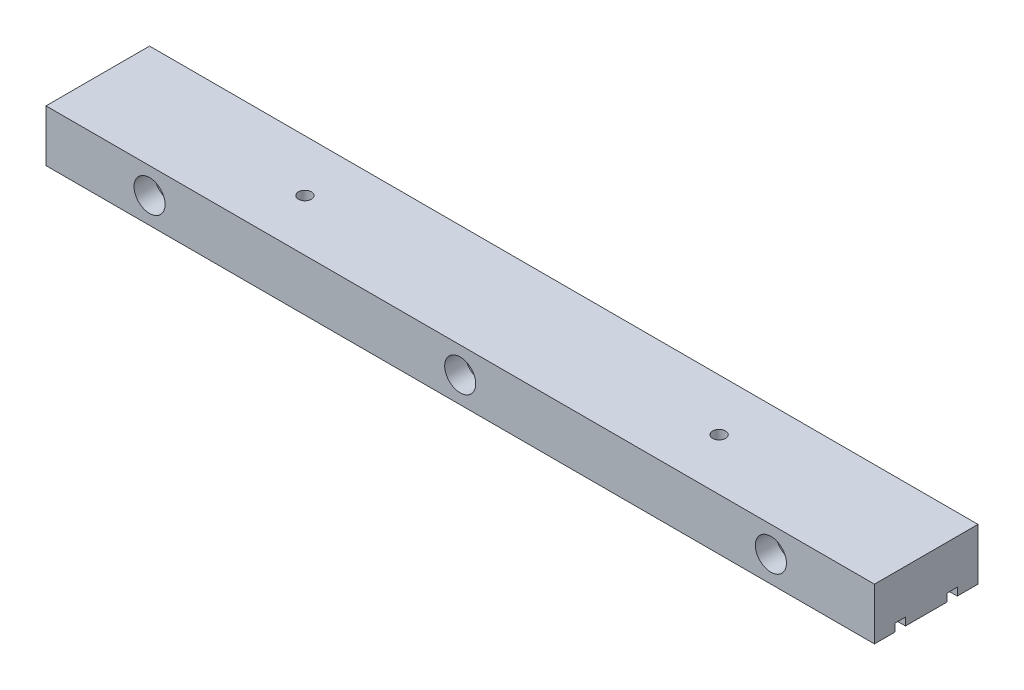
ISO-10303-21;
HEADER;
FILE_DESCRIPTION(('STEP AP214'),'2;1');
FILE_NAME('part.step','',(''),(''),'','','');
FILE_SCHEMA(('AUTOMOTIVE_DESIGN { 1 0 10303 214 1 1 1 1 }'));
ENDSEC;
DATA;
#1=APPLICATION_CONTEXT('core data for automotive mechanical design processes');
#2=APPLICATION_PROTOCOL_DEFINITION('international standard','automotive_design',2000,#1);
#3=PRODUCT_CONTEXT('',#1,'mechanical');
#4=PRODUCT('Part','Part','',(#3));
#5=PRODUCT_RELATED_PRODUCT_CATEGORY('part','',(#4));
#6=PRODUCT_DEFINITION_FORMATION('','',#4);
#7=PRODUCT_DEFINITION_CONTEXT('part definition',#1,'design');
#8=PRODUCT_DEFINITION('design','',#6,#7);
#9=PRODUCT_DEFINITION_SHAPE('','',#8);
#10=(LENGTH_UNIT() NAMED_UNIT(*) SI_UNIT(.MILLI.,.METRE.));
#11=(NAMED_UNIT(*) PLANE_ANGLE_UNIT() SI_UNIT($,.RADIAN.));
#12=(NAMED_UNIT(*) SI_UNIT($,.STERADIAN.) SOLID_ANGLE_UNIT());
#13=UNCERTAINTY_MEASURE_WITH_UNIT(LENGTH_MEASURE(1.E-05),#10,'distance_accuracy_value','');
#14=(GEOMETRIC_REPRESENTATION_CONTEXT(3) GLOBAL_UNCERTAINTY_ASSIGNED_CONTEXT((#13)) GLOBAL_UNIT_ASSIGNED_CONTEXT((#10,
#11,#12)) REPRESENTATION_CONTEXT('',''));
#15=CARTESIAN_POINT('',(0.,0.,0.));
#16=DIRECTION('',(0.,0.,1.));
#17=DIRECTION('',(1.,0.,0.));
#18=AXIS2_PLACEMENT_3D('',#15,#16,#17);
#19=CARTESIAN_POINT('',(20.,5.,20.));
#20=DIRECTION('',(0.,0.,-1.));
#21=DIRECTION('',(-1.,0.,0.));
#22=AXIS2_PLACEMENT_3D('',#19,#20,#21);
#23=CYLINDRICAL_SURFACE('',#22,1.25);
#24=CARTESIAN_POINT('',(20.,5.,4.));
#25=DIRECTION('',(0.,0.,-1.));
#26=DIRECTION('',(-1.,0.,0.));
#27=AXIS2_PLACEMENT_3D('',#24,#25,#26);
#28=CIRCLE('',#27,1.25);
#29=CARTESIAN_POINT('',(18.75,5.,4.));
#30=VERTEX_POINT('',#29);
#31=EDGE_CURVE('E194',#30,#30,#28,.F.);
#32=ORIENTED_EDGE('',*,*,#31,.F.);
#33=EDGE_LOOP('',(#32));
#34=FACE_BOUND('',#33,.T.);
#35=CARTESIAN_POINT('',(20.,5.,16.));
#36=DIRECTION('',(0.,0.,1.));
#37=DIRECTION('',(1.,0.,0.));
#38=AXIS2_PLACEMENT_3D('',#35,#36,#37);
#39=CIRCLE('',#38,1.25);
#40=CARTESIAN_POINT('',(21.25,5.,16.));
#41=VERTEX_POINT('',#40);
#42=EDGE_CURVE('E48',#41,#41,#39,.F.);
#43=ORIENTED_EDGE('',*,*,#42,.F.);
#44=EDGE_LOOP('',(#43));
#45=FACE_BOUND('',#44,.T.);
#46=ADVANCED_FACE('F44',(#34,#45),#23,.F.);
#47=CARTESIAN_POINT('',(80.,5.,20.));
#48=DIRECTION('',(0.,0.,-1.));
#49=DIRECTION('',(-1.,0.,0.));
#50=AXIS2_PLACEMENT_3D('',#47,#48,#49);
#51=CYLINDRICAL_SURFACE('',#50,1.25);
#52=CARTESIAN_POINT('',(80.,5.,4.));
#53=DIRECTION('',(0.,0.,-1.));
#54=DIRECTION('',(-1.,0.,0.));
#55=AXIS2_PLACEMENT_3D('',#52,#53,#54);
#56=CIRCLE('',#55,1.25);
#57=CARTESIAN_POINT('',(78.75,5.,4.));
#58=VERTEX_POINT('',#57);
#59=EDGE_CURVE('E189',#58,#58,#56,.F.);
#60=ORIENTED_EDGE('',*,*,#59,.F.);
#61=EDGE_LOOP('',(#60));
#62=FACE_BOUND('',#61,.T.);
#63=CARTESIAN_POINT('',(80.,5.,16.));
#64=DIRECTION('',(0.,0.,1.));
#65=DIRECTION('',(1.,0.,0.));
#66=AXIS2_PLACEMENT_3D('',#63,#64,#65);
#67=CIRCLE('',#66,1.25);
#68=CARTESIAN_POINT('',(81.25,5.,16.));
#69=VERTEX_POINT('',#68);
#70=EDGE_CURVE('E202',#69,#69,#67,.F.);
#71=ORIENTED_EDGE('',*,*,#70,.F.);
#72=EDGE_LOOP('',(#71));
#73=FACE_BOUND('',#72,.T.);
#74=ADVANCED_FACE('F371',(#62,#73),#51,.F.);
#75=CARTESIAN_POINT('',(140.,5.,20.));
#76=DIRECTION('',(0.,0.,-1.));
#77=DIRECTION('',(-1.,0.,0.));
#78=AXIS2_PLACEMENT_3D('',#75,#76,#77);
#79=CYLINDRICAL_SURFACE('',#78,1.25000000000001);
#80=CARTESIAN_POINT('',(140.,5.,4.));
#81=DIRECTION('',(0.,0.,-1.));
#82=DIRECTION('',(-1.,0.,0.));
#83=AXIS2_PLACEMENT_3D('',#80,#81,#82);
#84=CIRCLE('',#83,1.25000000000001);
#85=CARTESIAN_POINT('',(138.75,5.,4.));
#86=VERTEX_POINT('',#85);
#87=EDGE_CURVE('E185',#86,#86,#84,.F.);
#88=ORIENTED_EDGE('',*,*,#87,.F.);
#89=EDGE_LOOP('',(#88));
#90=FACE_BOUND('',#89,.T.);
#91=CARTESIAN_POINT('',(140.,5.,16.));
#92=DIRECTION('',(0.,0.,1.));
#93=DIRECTION('',(1.,0.,0.));
#94=AXIS2_PLACEMENT_3D('',#91,#92,#93);
#95=CIRCLE('',#94,1.25000000000001);
#96=CARTESIAN_POINT('',(141.25,5.,16.));
#97=VERTEX_POINT('',#96);
#98=EDGE_CURVE('E199',#97,#97,#95,.F.);
#99=ORIENTED_EDGE('',*,*,#98,.F.);
#100=EDGE_LOOP('',(#99));
#101=FACE_BOUND('',#100,.T.);
#102=ADVANCED_FACE('F377',(#90,#101),#79,.F.);
#103=CARTESIAN_POINT('',(0.,0.,20.));
#104=DIRECTION('',(0.,1.,0.));
#105=DIRECTION('',(0.,0.,1.));
#106=AXIS2_PLACEMENT_3D('',#103,#104,#105);
#107=PLANE('',#106);
#108=DIRECTION('',(0.,0.,-1.));
#109=VECTOR('',#108,1.);
#110=CARTESIAN_POINT('',(160.,0.,20.));
#111=LINE('',#110,#109);
#112=CARTESIAN_POINT('',(160.,0.,4.));
#113=VERTEX_POINT('',#112);
#114=CARTESIAN_POINT('',(160.,0.,0.));
#115=VERTEX_POINT('',#114);
#116=EDGE_CURVE('E151',#113,#115,#111,.T.);
#117=ORIENTED_EDGE('',*,*,#116,.F.);
#118=DIRECTION('',(-1.,0.,0.));
#119=VECTOR('',#118,1.);
#120=CARTESIAN_POINT('',(160.,0.,4.));
#121=LINE('',#120,#119);
#122=CARTESIAN_POINT('',(0.,0.,4.));
#123=VERTEX_POINT('',#122);
#124=EDGE_CURVE('E137',#113,#123,#121,.T.);
#125=ORIENTED_EDGE('',*,*,#124,.T.);
#126=DIRECTION('',(0.,0.,-1.));
#127=VECTOR('',#126,1.);
#128=CARTESIAN_POINT('',(0.,0.,20.));
#129=LINE('',#128,#127);
#130=CARTESIAN_POINT('',(0.,0.,0.));
#131=VERTEX_POINT('',#130);
#132=EDGE_CURVE('E56',#123,#131,#129,.T.);
#133=ORIENTED_EDGE('',*,*,#132,.T.);
#134=DIRECTION('',(1.,0.,0.));
#135=VECTOR('',#134,1.);
#136=CARTESIAN_POINT('',(0.,0.,0.));
#137=LINE('',#136,#135);
#138=EDGE_CURVE('E160',#131,#115,#137,.T.);
#139=ORIENTED_EDGE('',*,*,#138,.T.);
#140=EDGE_LOOP('',(#117,#125,#133,#139));
#141=FACE_BOUND('',#140,.T.);
#142=ADVANCED_FACE('F158',(#141),#107,.F.);
#143=CARTESIAN_POINT('',(120.,0.,10.));
#144=DIRECTION('',(0.,1.,0.));
#145=DIRECTION('',(-1.,0.,0.));
#146=AXIS2_PLACEMENT_3D('',#143,#144,#145);
#147=CIRCLE('',#146,1.25);
#148=CARTESIAN_POINT('',(118.75,0.,10.));
#149=VERTEX_POINT('',#148);
#150=EDGE_CURVE('E228',#149,#149,#147,.T.);
#151=ORIENTED_EDGE('',*,*,#150,.T.);
#152=EDGE_LOOP('',(#151));
#153=FACE_BOUND('',#152,.T.);
#154=CARTESIAN_POINT('',(40.,0.,10.));
#155=DIRECTION('',(0.,1.,0.));
#156=DIRECTION('',(-1.,0.,0.));
#157=AXIS2_PLACEMENT_3D('',#154,#155,#156);
#158=CIRCLE('',#157,1.25);
#159=CARTESIAN_POINT('',(38.75,0.,10.));
#160=VERTEX_POINT('',#159);
#161=EDGE_CURVE('E237',#160,#160,#158,.T.);
#162=ORIENTED_EDGE('',*,*,#161,.T.);
#163=EDGE_LOOP('',(#162));
#164=FACE_BOUND('',#163,.T.);
#165=CARTESIAN_POINT('',(0.,0.,14.));
#166=VERTEX_POINT('',#165);
#167=CARTESIAN_POINT('',(0.,0.,6.));
#168=VERTEX_POINT('',#167);
#169=EDGE_CURVE('E54',#166,#168,#129,.T.);
#170=ORIENTED_EDGE('',*,*,#169,.T.);
#171=DIRECTION('',(-1.,0.,0.));
#172=VECTOR('',#171,1.);
#173=CARTESIAN_POINT('',(160.,0.,6.));
#174=LINE('',#173,#172);
#175=CARTESIAN_POINT('',(160.,0.,6.));
#176=VERTEX_POINT('',#175);
#177=EDGE_CURVE('E147',#176,#168,#174,.T.);
#178=ORIENTED_EDGE('',*,*,#177,.F.);
#179=CARTESIAN_POINT('',(160.,0.,14.));
#180=VERTEX_POINT('',#179);
#181=EDGE_CURVE('E163',#180,#176,#111,.T.);
#182=ORIENTED_EDGE('',*,*,#181,.F.);
#183=DIRECTION('',(-1.,0.,0.));
#184=VECTOR('',#183,1.);
#185=CARTESIAN_POINT('',(160.,0.,14.));
#186=LINE('',#185,#184);
#187=EDGE_CURVE('E277',#180,#166,#186,.T.);
#188=ORIENTED_EDGE('',*,*,#187,.T.);
#189=EDGE_LOOP('',(#170,#178,#182,#188));
#190=FACE_BOUND('',#189,.T.);
#191=ADVANCED_FACE('F354',(#153,#164,#190),#107,.F.);
#192=CARTESIAN_POINT('',(0.,0.,20.));
#193=DIRECTION('',(1.,0.,0.));
#194=DIRECTION('',(0.,0.,-1.));
#195=AXIS2_PLACEMENT_3D('',#192,#193,#194);
#196=PLANE('',#195);
#197=ORIENTED_EDGE('',*,*,#132,.F.);
#198=DIRECTION('',(0.,-1.,0.));
#199=VECTOR('',#198,1.);
#200=CARTESIAN_POINT('',(0.,0.,4.));
#201=LINE('',#200,#199);
#202=CARTESIAN_POINT('',(0.,1.5,4.));
#203=VERTEX_POINT('',#202);
#204=EDGE_CURVE('E142',#203,#123,#201,.T.);
#205=ORIENTED_EDGE('',*,*,#204,.F.);
#206=DIRECTION('',(0.,0.,-1.));
#207=VECTOR('',#206,1.);
#208=CARTESIAN_POINT('',(0.,1.5,4.));
#209=LINE('',#208,#207);
#210=CARTESIAN_POINT('',(0.,1.5,6.));
#211=VERTEX_POINT('',#210);
#212=EDGE_CURVE('E156',#211,#203,#209,.T.);
#213=ORIENTED_EDGE('',*,*,#212,.F.);
#214=DIRECTION('',(0.,1.,0.));
#215=VECTOR('',#214,1.);
#216=CARTESIAN_POINT('',(0.,0.,6.));
#217=LINE('',#216,#215);
#218=EDGE_CURVE('E250',#168,#211,#217,.T.);
#219=ORIENTED_EDGE('',*,*,#218,.F.);
#220=ORIENTED_EDGE('',*,*,#169,.F.);
#221=DIRECTION('',(0.,-1.,0.));
#222=VECTOR('',#221,1.);
#223=CARTESIAN_POINT('',(0.,0.,14.));
#224=LINE('',#223,#222);
#225=CARTESIAN_POINT('',(0.,1.5,14.));
#226=VERTEX_POINT('',#225);
#227=EDGE_CURVE('E232',#226,#166,#224,.T.);
#228=ORIENTED_EDGE('',*,*,#227,.F.);
#229=DIRECTION('',(0.,0.,-1.));
#230=VECTOR('',#229,1.);
#231=CARTESIAN_POINT('',(0.,1.5,14.));
#232=LINE('',#231,#230);
#233=CARTESIAN_POINT('',(0.,1.5,16.));
#234=VERTEX_POINT('',#233);
#235=EDGE_CURVE('E272',#234,#226,#232,.T.);
#236=ORIENTED_EDGE('',*,*,#235,.F.);
#237=DIRECTION('',(0.,1.,0.));
#238=VECTOR('',#237,1.);
#239=CARTESIAN_POINT('',(0.,0.,16.));
#240=LINE('',#239,#238);
#241=CARTESIAN_POINT('',(0.,0.,16.));
#242=VERTEX_POINT('',#241);
#243=EDGE_CURVE('E280',#242,#234,#240,.T.);
#244=ORIENTED_EDGE('',*,*,#243,.F.);
#245=CARTESIAN_POINT('',(0.,0.,20.));
#246=VERTEX_POINT('',#245);
#247=EDGE_CURVE('E11',#246,#242,#129,.T.);
#248=ORIENTED_EDGE('',*,*,#247,.F.);
#249=DIRECTION('',(0.,-1.,0.));
#250=VECTOR('',#249,1.);
#251=CARTESIAN_POINT('',(0.,0.,20.));
#252=LINE('',#251,#250);
#253=CARTESIAN_POINT('',(0.,10.,20.));
#254=VERTEX_POINT('',#253);
#255=EDGE_CURVE('E298',#254,#246,#252,.T.);
#256=ORIENTED_EDGE('',*,*,#255,.F.);
#257=DIRECTION('',(0.,0.,-1.));
#258=VECTOR('',#257,1.);
#259=CARTESIAN_POINT('',(0.,10.,20.));
#260=LINE('',#259,#258);
#261=CARTESIAN_POINT('',(0.,10.,0.));
#262=VERTEX_POINT('',#261);
#263=EDGE_CURVE('E172',#254,#262,#260,.T.);
#264=ORIENTED_EDGE('',*,*,#263,.T.);
#265=DIRECTION('',(0.,-1.,0.));
#266=VECTOR('',#265,1.);
#267=CARTESIAN_POINT('',(0.,0.,0.));
#268=LINE('',#267,#266);
#269=EDGE_CURVE('E261',#262,#131,#268,.T.);
#270=ORIENTED_EDGE('',*,*,#269,.T.);
#271=EDGE_LOOP('',(#197,#205,#213,#219,#220,#228,#236,#244,#248,#256,#264,#270));
#272=FACE_BOUND('',#271,.T.);
#273=ADVANCED_FACE('F46',(#272),#196,.F.);
#274=ORIENTED_EDGE('',*,*,#247,.T.);
#275=DIRECTION('',(-1.,0.,0.));
#276=VECTOR('',#275,1.);
#277=CARTESIAN_POINT('',(160.,0.,16.));
#278=LINE('',#277,#276);
#279=CARTESIAN_POINT('',(160.,0.,16.));
#280=VERTEX_POINT('',#279);
#281=EDGE_CURVE('E292',#280,#242,#278,.T.);
#282=ORIENTED_EDGE('',*,*,#281,.F.);
#283=CARTESIAN_POINT('',(160.,0.,20.));
#284=VERTEX_POINT('',#283);
#285=EDGE_CURVE('E166',#284,#280,#111,.T.);
#286=ORIENTED_EDGE('',*,*,#285,.F.);
#287=DIRECTION('',(1.,0.,0.));
#288=VECTOR('',#287,1.);
#289=CARTESIAN_POINT('',(0.,0.,20.));
#290=LINE('',#289,#288);
#291=EDGE_CURVE('E302',#246,#284,#290,.T.);
#292=ORIENTED_EDGE('',*,*,#291,.F.);
#293=EDGE_LOOP('',(#274,#282,#286,#292));
#294=FACE_BOUND('',#293,.T.);
#295=ADVANCED_FACE('F341',(#294),#107,.F.);
#296=CARTESIAN_POINT('',(160.,0.,20.));
#297=DIRECTION('',(-1.,0.,0.));
#298=DIRECTION('',(0.,0.,1.));
#299=AXIS2_PLACEMENT_3D('',#296,#297,#298);
#300=PLANE('',#299);
#301=DIRECTION('',(0.,0.,-1.));
#302=VECTOR('',#301,1.);
#303=CARTESIAN_POINT('',(160.,1.5,4.));
#304=LINE('',#303,#302);
#305=CARTESIAN_POINT('',(160.,1.5,6.));
#306=VERTEX_POINT('',#305);
#307=CARTESIAN_POINT('',(160.,1.5,4.));
#308=VERTEX_POINT('',#307);
#309=EDGE_CURVE('E63',#306,#308,#304,.T.);
#310=ORIENTED_EDGE('',*,*,#309,.T.);
#311=DIRECTION('',(0.,-1.,0.));
#312=VECTOR('',#311,1.);
#313=CARTESIAN_POINT('',(160.,0.,4.));
#314=LINE('',#313,#312);
#315=EDGE_CURVE('E140',#308,#113,#314,.T.);
#316=ORIENTED_EDGE('',*,*,#315,.T.);
#317=ORIENTED_EDGE('',*,*,#116,.T.);
#318=DIRECTION('',(0.,1.,0.));
#319=VECTOR('',#318,1.);
#320=CARTESIAN_POINT('',(160.,0.,0.));
#321=LINE('',#320,#319);
#322=CARTESIAN_POINT('',(160.,10.,0.));
#323=VERTEX_POINT('',#322);
#324=EDGE_CURVE('E317',#115,#323,#321,.T.);
#325=ORIENTED_EDGE('',*,*,#324,.T.);
#326=DIRECTION('',(0.,0.,-1.));
#327=VECTOR('',#326,1.);
#328=CARTESIAN_POINT('',(160.,10.,20.));
#329=LINE('',#328,#327);
#330=CARTESIAN_POINT('',(160.,10.,20.));
#331=VERTEX_POINT('',#330);
#332=EDGE_CURVE('E164',#331,#323,#329,.T.);
#333=ORIENTED_EDGE('',*,*,#332,.F.);
#334=DIRECTION('',(0.,1.,0.));
#335=VECTOR('',#334,1.);
#336=CARTESIAN_POINT('',(160.,0.,20.));
#337=LINE('',#336,#335);
#338=EDGE_CURVE('E306',#284,#331,#337,.T.);
#339=ORIENTED_EDGE('',*,*,#338,.F.);
#340=ORIENTED_EDGE('',*,*,#285,.T.);
#341=DIRECTION('',(0.,1.,0.));
#342=VECTOR('',#341,1.);
#343=CARTESIAN_POINT('',(160.,0.,16.));
#344=LINE('',#343,#342);
#345=CARTESIAN_POINT('',(160.,1.5,16.));
#346=VERTEX_POINT('',#345);
#347=EDGE_CURVE('E271',#280,#346,#344,.T.);
#348=ORIENTED_EDGE('',*,*,#347,.T.);
#349=DIRECTION('',(0.,0.,-1.));
#350=VECTOR('',#349,1.);
#351=CARTESIAN_POINT('',(160.,1.5,14.));
#352=LINE('',#351,#350);
#353=CARTESIAN_POINT('',(160.,1.5,14.));
#354=VERTEX_POINT('',#353);
#355=EDGE_CURVE('E71',#346,#354,#352,.T.);
#356=ORIENTED_EDGE('',*,*,#355,.T.);
#357=DIRECTION('',(0.,-1.,0.));
#358=VECTOR('',#357,1.);
#359=CARTESIAN_POINT('',(160.,0.,14.));
#360=LINE('',#359,#358);
#361=EDGE_CURVE('E267',#354,#180,#360,.T.);
#362=ORIENTED_EDGE('',*,*,#361,.T.);
#363=ORIENTED_EDGE('',*,*,#181,.T.);
#364=DIRECTION('',(0.,1.,0.));
#365=VECTOR('',#364,1.);
#366=CARTESIAN_POINT('',(160.,0.,6.));
#367=LINE('',#366,#365);
#368=EDGE_CURVE('E155',#176,#306,#367,.T.);
#369=ORIENTED_EDGE('',*,*,#368,.T.);
#370=EDGE_LOOP('',(#310,#316,#317,#325,#333,#339,#340,#348,#356,#362,#363,#369));
#371=FACE_BOUND('',#370,.T.);
#372=ADVANCED_FACE('F150',(#371),#300,.F.);
#373=CARTESIAN_POINT('',(0.,10.,20.));
#374=DIRECTION('',(0.,-1.,0.));
#375=DIRECTION('',(0.,0.,-1.));
#376=AXIS2_PLACEMENT_3D('',#373,#374,#375);
#377=PLANE('',#376);
#378=CARTESIAN_POINT('',(120.,9.99999999999998,10.));
#379=DIRECTION('',(0.,1.,0.));
#380=DIRECTION('',(-1.,0.,0.));
#381=AXIS2_PLACEMENT_3D('',#378,#379,#380);
#382=CIRCLE('',#381,1.25);
#383=CARTESIAN_POINT('',(118.75,9.99999999999998,10.));
#384=VERTEX_POINT('',#383);
#385=EDGE_CURVE('E233',#384,#384,#382,.T.);
#386=ORIENTED_EDGE('',*,*,#385,.F.);
#387=EDGE_LOOP('',(#386));
#388=FACE_BOUND('',#387,.T.);
#389=CARTESIAN_POINT('',(40.,9.99999999999999,10.));
#390=DIRECTION('',(0.,1.,0.));
#391=DIRECTION('',(-1.,0.,0.));
#392=AXIS2_PLACEMENT_3D('',#389,#390,#391);
#393=CIRCLE('',#392,1.25);
#394=CARTESIAN_POINT('',(38.75,9.99999999999999,10.));
#395=VERTEX_POINT('',#394);
#396=EDGE_CURVE('E198',#395,#395,#393,.T.);
#397=ORIENTED_EDGE('',*,*,#396,.F.);
#398=EDGE_LOOP('',(#397));
#399=FACE_BOUND('',#398,.T.);
#400=DIRECTION('',(-1.,0.,0.));
#401=VECTOR('',#400,1.);
#402=CARTESIAN_POINT('',(0.,10.,0.));
#403=LINE('',#402,#401);
#404=EDGE_CURVE('E303',#323,#262,#403,.T.);
#405=ORIENTED_EDGE('',*,*,#404,.T.);
#406=ORIENTED_EDGE('',*,*,#263,.F.);
#407=DIRECTION('',(-1.,0.,0.));
#408=VECTOR('',#407,1.);
#409=CARTESIAN_POINT('',(0.,10.,20.));
#410=LINE('',#409,#408);
#411=EDGE_CURVE('E309',#331,#254,#410,.T.);
#412=ORIENTED_EDGE('',*,*,#411,.F.);
#413=ORIENTED_EDGE('',*,*,#332,.T.);
#414=EDGE_LOOP('',(#405,#406,#412,#413));
#415=FACE_BOUND('',#414,.T.);
#416=ADVANCED_FACE('F336',(#388,#399,#415),#377,.F.);
#417=CARTESIAN_POINT('',(0.,0.,20.));
#418=DIRECTION('',(0.,0.,-1.));
#419=DIRECTION('',(-1.,0.,0.));
#420=AXIS2_PLACEMENT_3D('',#417,#418,#419);
#421=PLANE('',#420);
#422=CARTESIAN_POINT('',(20.,5.,20.));
#423=DIRECTION('',(0.,0.,1.));
#424=DIRECTION('',(1.,0.,0.));
#425=AXIS2_PLACEMENT_3D('',#422,#423,#424);
#426=CIRCLE('',#425,3.);
#427=CARTESIAN_POINT('',(23.,5.,20.));
#428=VERTEX_POINT('',#427);
#429=EDGE_CURVE('E782',#428,#428,#426,.T.);
#430=ORIENTED_EDGE('',*,*,#429,.F.);
#431=EDGE_LOOP('',(#430));
#432=FACE_BOUND('',#431,.T.);
#433=CARTESIAN_POINT('',(80.,5.,20.));
#434=DIRECTION('',(0.,0.,1.));
#435=DIRECTION('',(1.,0.,0.));
#436=AXIS2_PLACEMENT_3D('',#433,#434,#435);
#437=CIRCLE('',#436,2.99999999999999);
#438=CARTESIAN_POINT('',(83.,5.,20.));
#439=VERTEX_POINT('',#438);
#440=EDGE_CURVE('E791',#439,#439,#437,.T.);
#441=ORIENTED_EDGE('',*,*,#440,.F.);
#442=EDGE_LOOP('',(#441));
#443=FACE_BOUND('',#442,.T.);
#444=CARTESIAN_POINT('',(140.,5.,20.));
#445=DIRECTION('',(0.,0.,1.));
#446=DIRECTION('',(1.,0.,0.));
#447=AXIS2_PLACEMENT_3D('',#444,#445,#446);
#448=CIRCLE('',#447,2.99999999999999);
#449=CARTESIAN_POINT('',(143.,5.,20.));
#450=VERTEX_POINT('',#449);
#451=EDGE_CURVE('E801',#450,#450,#448,.T.);
#452=ORIENTED_EDGE('',*,*,#451,.F.);
#453=EDGE_LOOP('',(#452));
#454=FACE_BOUND('',#453,.T.);
#455=ORIENTED_EDGE('',*,*,#255,.T.);
#456=ORIENTED_EDGE('',*,*,#291,.T.);
#457=ORIENTED_EDGE('',*,*,#338,.T.);
#458=ORIENTED_EDGE('',*,*,#411,.T.);
#459=EDGE_LOOP('',(#455,#456,#457,#458));
#460=FACE_BOUND('',#459,.T.);
#461=ADVANCED_FACE('F338',(#432,#443,#454,#460),#421,.F.);
#462=CARTESIAN_POINT('',(0.,0.,0.));
#463=DIRECTION('',(0.,0.,-1.));
#464=DIRECTION('',(-1.,0.,0.));
#465=AXIS2_PLACEMENT_3D('',#462,#463,#464);
#466=PLANE('',#465);
#467=CARTESIAN_POINT('',(140.,5.,0.));
#468=DIRECTION('',(0.,0.,-1.));
#469=DIRECTION('',(-1.,0.,0.));
#470=AXIS2_PLACEMENT_3D('',#467,#468,#469);
#471=CIRCLE('',#470,2.99999999999999);
#472=CARTESIAN_POINT('',(137.,5.,0.));
#473=VERTEX_POINT('',#472);
#474=EDGE_CURVE('E808',#473,#473,#471,.T.);
#475=ORIENTED_EDGE('',*,*,#474,.F.);
#476=EDGE_LOOP('',(#475));
#477=FACE_BOUND('',#476,.T.);
#478=CARTESIAN_POINT('',(80.,5.,0.));
#479=DIRECTION('',(0.,0.,-1.));
#480=DIRECTION('',(-1.,0.,0.));
#481=AXIS2_PLACEMENT_3D('',#478,#479,#480);
#482=CIRCLE('',#481,3.00000000000001);
#483=CARTESIAN_POINT('',(77.,5.,0.));
#484=VERTEX_POINT('',#483);
#485=EDGE_CURVE('E224',#484,#484,#482,.T.);
#486=ORIENTED_EDGE('',*,*,#485,.F.);
#487=EDGE_LOOP('',(#486));
#488=FACE_BOUND('',#487,.T.);
#489=CARTESIAN_POINT('',(20.,5.,0.));
#490=DIRECTION('',(0.,0.,-1.));
#491=DIRECTION('',(-1.,0.,0.));
#492=AXIS2_PLACEMENT_3D('',#489,#490,#491);
#493=CIRCLE('',#492,3.);
#494=CARTESIAN_POINT('',(17.,5.,0.));
#495=VERTEX_POINT('',#494);
#496=EDGE_CURVE('E211',#495,#495,#493,.T.);
#497=ORIENTED_EDGE('',*,*,#496,.F.);
#498=EDGE_LOOP('',(#497));
#499=FACE_BOUND('',#498,.T.);
#500=ORIENTED_EDGE('',*,*,#269,.F.);
#501=ORIENTED_EDGE('',*,*,#404,.F.);
#502=ORIENTED_EDGE('',*,*,#324,.F.);
#503=ORIENTED_EDGE('',*,*,#138,.F.);
#504=EDGE_LOOP('',(#500,#501,#502,#503));
#505=FACE_BOUND('',#504,.T.);
#506=ADVANCED_FACE('F334',(#477,#488,#499,#505),#466,.T.);
#507=CARTESIAN_POINT('',(160.,0.,14.));
#508=DIRECTION('',(0.,0.,-1.));
#509=DIRECTION('',(-1.,0.,0.));
#510=AXIS2_PLACEMENT_3D('',#507,#508,#509);
#511=PLANE('',#510);
#512=ORIENTED_EDGE('',*,*,#227,.T.);
#513=ORIENTED_EDGE('',*,*,#187,.F.);
#514=ORIENTED_EDGE('',*,*,#361,.F.);
#515=DIRECTION('',(-1.,0.,0.));
#516=VECTOR('',#515,1.);
#517=CARTESIAN_POINT('',(160.,1.5,14.));
#518=LINE('',#517,#516);
#519=EDGE_CURVE('E251',#354,#226,#518,.T.);
#520=ORIENTED_EDGE('',*,*,#519,.T.);
#521=EDGE_LOOP('',(#512,#513,#514,#520));
#522=FACE_BOUND('',#521,.T.);
#523=ADVANCED_FACE('F462',(#522),#511,.F.);
#524=CARTESIAN_POINT('',(160.,1.5,14.));
#525=DIRECTION('',(0.,1.,0.));
#526=DIRECTION('',(0.,0.,1.));
#527=AXIS2_PLACEMENT_3D('',#524,#525,#526);
#528=PLANE('',#527);
#529=ORIENTED_EDGE('',*,*,#235,.T.);
#530=ORIENTED_EDGE('',*,*,#519,.F.);
#531=ORIENTED_EDGE('',*,*,#355,.F.);
#532=DIRECTION('',(-1.,0.,0.));
#533=VECTOR('',#532,1.);
#534=CARTESIAN_POINT('',(160.,1.5,16.));
#535=LINE('',#534,#533);
#536=EDGE_CURVE('E289',#346,#234,#535,.T.);
#537=ORIENTED_EDGE('',*,*,#536,.T.);
#538=EDGE_LOOP('',(#529,#530,#531,#537));
#539=FACE_BOUND('',#538,.T.);
#540=ADVANCED_FACE('F348',(#539),#528,.F.);
#541=CARTESIAN_POINT('',(160.,0.,16.));
#542=DIRECTION('',(0.,0.,1.));
#543=DIRECTION('',(1.,0.,0.));
#544=AXIS2_PLACEMENT_3D('',#541,#542,#543);
#545=PLANE('',#544);
#546=ORIENTED_EDGE('',*,*,#243,.T.);
#547=ORIENTED_EDGE('',*,*,#536,.F.);
#548=ORIENTED_EDGE('',*,*,#347,.F.);
#549=ORIENTED_EDGE('',*,*,#281,.T.);
#550=EDGE_LOOP('',(#546,#547,#548,#549));
#551=FACE_BOUND('',#550,.T.);
#552=ADVANCED_FACE('F344',(#551),#545,.F.);
#553=CARTESIAN_POINT('',(160.,0.,4.));
#554=DIRECTION('',(0.,0.,-1.));
#555=DIRECTION('',(0.,1.,0.));
#556=AXIS2_PLACEMENT_3D('',#553,#554,#555);
#557=PLANE('',#556);
#558=ORIENTED_EDGE('',*,*,#204,.T.);
#559=ORIENTED_EDGE('',*,*,#124,.F.);
#560=ORIENTED_EDGE('',*,*,#315,.F.);
#561=DIRECTION('',(-1.,0.,0.));
#562=VECTOR('',#561,1.);
#563=CARTESIAN_POINT('',(160.,1.5,4.));
#564=LINE('',#563,#562);
#565=EDGE_CURVE('E258',#308,#203,#564,.T.);
#566=ORIENTED_EDGE('',*,*,#565,.T.);
#567=EDGE_LOOP('',(#558,#559,#560,#566));
#568=FACE_BOUND('',#567,.T.);
#569=ADVANCED_FACE('F139',(#568),#557,.F.);
#570=CARTESIAN_POINT('',(160.,1.5,4.));
#571=DIRECTION('',(0.,1.,0.));
#572=DIRECTION('',(0.,0.,1.));
#573=AXIS2_PLACEMENT_3D('',#570,#571,#572);
#574=PLANE('',#573);
#575=ORIENTED_EDGE('',*,*,#212,.T.);
#576=ORIENTED_EDGE('',*,*,#565,.F.);
#577=ORIENTED_EDGE('',*,*,#309,.F.);
#578=DIRECTION('',(-1.,0.,0.));
#579=VECTOR('',#578,1.);
#580=CARTESIAN_POINT('',(160.,1.5,6.));
#581=LINE('',#580,#579);
#582=EDGE_CURVE('E262',#306,#211,#581,.T.);
#583=ORIENTED_EDGE('',*,*,#582,.T.);
#584=EDGE_LOOP('',(#575,#576,#577,#583));
#585=FACE_BOUND('',#584,.T.);
#586=ADVANCED_FACE('F359',(#585),#574,.F.);
#587=CARTESIAN_POINT('',(160.,0.,6.));
#588=DIRECTION('',(0.,0.,1.));
#589=DIRECTION('',(0.,-1.,0.));
#590=AXIS2_PLACEMENT_3D('',#587,#588,#589);
#591=PLANE('',#590);
#592=ORIENTED_EDGE('',*,*,#218,.T.);
#593=ORIENTED_EDGE('',*,*,#582,.F.);
#594=ORIENTED_EDGE('',*,*,#368,.F.);
#595=ORIENTED_EDGE('',*,*,#177,.T.);
#596=EDGE_LOOP('',(#592,#593,#594,#595));
#597=FACE_BOUND('',#596,.T.);
#598=ADVANCED_FACE('F357',(#597),#591,.F.);
#599=CARTESIAN_POINT('',(40.,0.,10.));
#600=DIRECTION('',(0.,1.,0.));
#601=DIRECTION('',(-1.,0.,0.));
#602=AXIS2_PLACEMENT_3D('',#599,#600,#601);
#603=CYLINDRICAL_SURFACE('',#602,1.25);
#604=ORIENTED_EDGE('',*,*,#161,.F.);
#605=EDGE_LOOP('',(#604));
#606=FACE_BOUND('',#605,.T.);
#607=ORIENTED_EDGE('',*,*,#396,.T.);
#608=EDGE_LOOP('',(#607));
#609=FACE_BOUND('',#608,.T.);
#610=ADVANCED_FACE('F366',(#606,#609),#603,.F.);
#611=CARTESIAN_POINT('',(120.,0.,10.));
#612=DIRECTION('',(0.,1.,0.));
#613=DIRECTION('',(-1.,0.,0.));
#614=AXIS2_PLACEMENT_3D('',#611,#612,#613);
#615=CYLINDRICAL_SURFACE('',#614,1.25);
#616=ORIENTED_EDGE('',*,*,#150,.F.);
#617=EDGE_LOOP('',(#616));
#618=FACE_BOUND('',#617,.T.);
#619=ORIENTED_EDGE('',*,*,#385,.T.);
#620=EDGE_LOOP('',(#619));
#621=FACE_BOUND('',#620,.T.);
#622=ADVANCED_FACE('F384',(#618,#621),#615,.F.);
#623=CARTESIAN_POINT('',(140.,5.,4.));
#624=DIRECTION('',(0.,0.,-1.));
#625=DIRECTION('',(-1.,0.,0.));
#626=AXIS2_PLACEMENT_3D('',#623,#624,#625);
#627=PLANE('',#626);
#628=CARTESIAN_POINT('',(140.,5.,4.));
#629=DIRECTION('',(0.,0.,-1.));
#630=DIRECTION('',(-1.,0.,0.));
#631=AXIS2_PLACEMENT_3D('',#628,#629,#630);
#632=CIRCLE('',#631,2.99999999999999);
#633=CARTESIAN_POINT('',(137.,5.,4.));
#634=VERTEX_POINT('',#633);
#635=EDGE_CURVE('E190',#634,#634,#632,.T.);
#636=ORIENTED_EDGE('',*,*,#635,.T.);
#637=EDGE_LOOP('',(#636));
#638=FACE_BOUND('',#637,.T.);
#639=ORIENTED_EDGE('',*,*,#87,.T.);
#640=EDGE_LOOP('',(#639));
#641=FACE_BOUND('',#640,.T.);
#642=ADVANCED_FACE('F386',(#638,#641),#627,.T.);
#643=CARTESIAN_POINT('',(140.,5.,4.));
#644=DIRECTION('',(0.,0.,-1.));
#645=DIRECTION('',(-1.,0.,0.));
#646=AXIS2_PLACEMENT_3D('',#643,#644,#645);
#647=CYLINDRICAL_SURFACE('',#646,2.99999999999999);
#648=ORIENTED_EDGE('',*,*,#635,.F.);
#649=EDGE_LOOP('',(#648));
#650=FACE_BOUND('',#649,.T.);
#651=ORIENTED_EDGE('',*,*,#474,.T.);
#652=EDGE_LOOP('',(#651));
#653=FACE_BOUND('',#652,.T.);
#654=ADVANCED_FACE('F522',(#650,#653),#647,.F.);
#655=CARTESIAN_POINT('',(80.,5.,4.));
#656=DIRECTION('',(0.,0.,-1.));
#657=DIRECTION('',(-1.,0.,0.));
#658=AXIS2_PLACEMENT_3D('',#655,#656,#657);
#659=PLANE('',#658);
#660=CARTESIAN_POINT('',(80.,5.,4.));
#661=DIRECTION('',(0.,0.,-1.));
#662=DIRECTION('',(-1.,0.,0.));
#663=AXIS2_PLACEMENT_3D('',#660,#661,#662);
#664=CIRCLE('',#663,3.00000000000001);
#665=CARTESIAN_POINT('',(77.,5.,4.));
#666=VERTEX_POINT('',#665);
#667=EDGE_CURVE('E812',#666,#666,#664,.T.);
#668=ORIENTED_EDGE('',*,*,#667,.T.);
#669=EDGE_LOOP('',(#668));
#670=FACE_BOUND('',#669,.T.);
#671=ORIENTED_EDGE('',*,*,#59,.T.);
#672=EDGE_LOOP('',(#671));
#673=FACE_BOUND('',#672,.T.);
#674=ADVANCED_FACE('F532',(#670,#673),#659,.T.);
#675=CARTESIAN_POINT('',(80.,5.,4.));
#676=DIRECTION('',(0.,0.,-1.));
#677=DIRECTION('',(-1.,0.,0.));
#678=AXIS2_PLACEMENT_3D('',#675,#676,#677);
#679=CYLINDRICAL_SURFACE('',#678,3.00000000000001);
#680=ORIENTED_EDGE('',*,*,#667,.F.);
#681=EDGE_LOOP('',(#680));
#682=FACE_BOUND('',#681,.T.);
#683=ORIENTED_EDGE('',*,*,#485,.T.);
#684=EDGE_LOOP('',(#683));
#685=FACE_BOUND('',#684,.T.);
#686=ADVANCED_FACE('F542',(#682,#685),#679,.F.);
#687=CARTESIAN_POINT('',(20.,5.,4.));
#688=DIRECTION('',(0.,0.,-1.));
#689=DIRECTION('',(-1.,0.,0.));
#690=AXIS2_PLACEMENT_3D('',#687,#688,#689);
#691=PLANE('',#690);
#692=CARTESIAN_POINT('',(20.,5.,4.));
#693=DIRECTION('',(0.,0.,-1.));
#694=DIRECTION('',(-1.,0.,0.));
#695=AXIS2_PLACEMENT_3D('',#692,#693,#694);
#696=CIRCLE('',#695,3.);
#697=CARTESIAN_POINT('',(17.,5.,4.));
#698=VERTEX_POINT('',#697);
#699=EDGE_CURVE('E217',#698,#698,#696,.T.);
#700=ORIENTED_EDGE('',*,*,#699,.T.);
#701=EDGE_LOOP('',(#700));
#702=FACE_BOUND('',#701,.T.);
#703=ORIENTED_EDGE('',*,*,#31,.T.);
#704=EDGE_LOOP('',(#703));
#705=FACE_BOUND('',#704,.T.);
#706=ADVANCED_FACE('F551',(#702,#705),#691,.T.);
#707=CARTESIAN_POINT('',(20.,5.,4.));
#708=DIRECTION('',(0.,0.,-1.));
#709=DIRECTION('',(-1.,0.,0.));
#710=AXIS2_PLACEMENT_3D('',#707,#708,#709);
#711=CYLINDRICAL_SURFACE('',#710,3.);
#712=ORIENTED_EDGE('',*,*,#699,.F.);
#713=EDGE_LOOP('',(#712));
#714=FACE_BOUND('',#713,.T.);
#715=ORIENTED_EDGE('',*,*,#496,.T.);
#716=EDGE_LOOP('',(#715));
#717=FACE_BOUND('',#716,.T.);
#718=ADVANCED_FACE('F561',(#714,#717),#711,.F.);
#719=CARTESIAN_POINT('',(140.,5.,16.));
#720=DIRECTION('',(0.,0.,1.));
#721=DIRECTION('',(1.,0.,0.));
#722=AXIS2_PLACEMENT_3D('',#719,#720,#721);
#723=PLANE('',#722);
#724=CARTESIAN_POINT('',(140.,5.,16.));
#725=DIRECTION('',(0.,0.,1.));
#726=DIRECTION('',(1.,0.,0.));
#727=AXIS2_PLACEMENT_3D('',#724,#725,#726);
#728=CIRCLE('',#727,2.99999999999999);
#729=CARTESIAN_POINT('',(143.,5.,16.));
#730=VERTEX_POINT('',#729);
#731=EDGE_CURVE('E797',#730,#730,#728,.T.);
#732=ORIENTED_EDGE('',*,*,#731,.T.);
#733=EDGE_LOOP('',(#732));
#734=FACE_BOUND('',#733,.T.);
#735=ORIENTED_EDGE('',*,*,#98,.T.);
#736=EDGE_LOOP('',(#735));
#737=FACE_BOUND('',#736,.T.);
#738=ADVANCED_FACE('F571',(#734,#737),#723,.T.);
#739=CARTESIAN_POINT('',(140.,5.,16.));
#740=DIRECTION('',(0.,0.,1.));
#741=DIRECTION('',(1.,0.,0.));
#742=AXIS2_PLACEMENT_3D('',#739,#740,#741);
#743=CYLINDRICAL_SURFACE('',#742,2.99999999999999);
#744=ORIENTED_EDGE('',*,*,#731,.F.);
#745=EDGE_LOOP('',(#744));
#746=FACE_BOUND('',#745,.T.);
#747=ORIENTED_EDGE('',*,*,#451,.T.);
#748=EDGE_LOOP('',(#747));
#749=FACE_BOUND('',#748,.T.);
#750=ADVANCED_FACE('F582',(#746,#749),#743,.F.);
#751=CARTESIAN_POINT('',(80.,5.,16.));
#752=DIRECTION('',(0.,0.,1.));
#753=DIRECTION('',(1.,0.,0.));
#754=AXIS2_PLACEMENT_3D('',#751,#752,#753);
#755=PLANE('',#754);
#756=CARTESIAN_POINT('',(80.,5.,16.));
#757=DIRECTION('',(0.,0.,1.));
#758=DIRECTION('',(1.,0.,0.));
#759=AXIS2_PLACEMENT_3D('',#756,#757,#758);
#760=CIRCLE('',#759,2.99999999999999);
#761=CARTESIAN_POINT('',(83.,5.,16.));
#762=VERTEX_POINT('',#761);
#763=EDGE_CURVE('E784',#762,#762,#760,.T.);
#764=ORIENTED_EDGE('',*,*,#763,.T.);
#765=EDGE_LOOP('',(#764));
#766=FACE_BOUND('',#765,.T.);
#767=ORIENTED_EDGE('',*,*,#70,.T.);
#768=EDGE_LOOP('',(#767));
#769=FACE_BOUND('',#768,.T.);
#770=ADVANCED_FACE('F593',(#766,#769),#755,.T.);
#771=CARTESIAN_POINT('',(80.,5.,16.));
#772=DIRECTION('',(0.,0.,1.));
#773=DIRECTION('',(1.,0.,0.));
#774=AXIS2_PLACEMENT_3D('',#771,#772,#773);
#775=CYLINDRICAL_SURFACE('',#774,2.99999999999999);
#776=ORIENTED_EDGE('',*,*,#763,.F.);
#777=EDGE_LOOP('',(#776));
#778=FACE_BOUND('',#777,.T.);
#779=ORIENTED_EDGE('',*,*,#440,.T.);
#780=EDGE_LOOP('',(#779));
#781=FACE_BOUND('',#780,.T.);
#782=ADVANCED_FACE('F604',(#778,#781),#775,.F.);
#783=CARTESIAN_POINT('',(20.,5.,16.));
#784=DIRECTION('',(0.,0.,1.));
#785=DIRECTION('',(1.,0.,0.));
#786=AXIS2_PLACEMENT_3D('',#783,#784,#785);
#787=PLANE('',#786);
#788=CARTESIAN_POINT('',(20.,5.,16.));
#789=DIRECTION('',(0.,0.,1.));
#790=DIRECTION('',(1.,0.,0.));
#791=AXIS2_PLACEMENT_3D('',#788,#789,#790);
#792=CIRCLE('',#791,3.);
#793=CARTESIAN_POINT('',(23.,5.,16.));
#794=VERTEX_POINT('',#793);
#795=EDGE_CURVE('E203',#794,#794,#792,.T.);
#796=ORIENTED_EDGE('',*,*,#795,.T.);
#797=EDGE_LOOP('',(#796));
#798=FACE_BOUND('',#797,.T.);
#799=ORIENTED_EDGE('',*,*,#42,.T.);
#800=EDGE_LOOP('',(#799));
#801=FACE_BOUND('',#800,.T.);
#802=ADVANCED_FACE('F614',(#798,#801),#787,.T.);
#803=CARTESIAN_POINT('',(20.,5.,16.));
#804=DIRECTION('',(0.,0.,1.));
#805=DIRECTION('',(1.,0.,0.));
#806=AXIS2_PLACEMENT_3D('',#803,#804,#805);
#807=CYLINDRICAL_SURFACE('',#806,3.);
#808=ORIENTED_EDGE('',*,*,#795,.F.);
#809=EDGE_LOOP('',(#808));
#810=FACE_BOUND('',#809,.T.);
#811=ORIENTED_EDGE('',*,*,#429,.T.);
#812=EDGE_LOOP('',(#811));
#813=FACE_BOUND('',#812,.T.);
#814=ADVANCED_FACE('F625',(#810,#813),#807,.F.);
#815=CLOSED_SHELL('',(#46,#74,#102,#142,#191,#273,#295,#372,#416,#461,#506,#523,#540,#552,#569,
#586,#598,#610,#622,#642,#654,#674,#686,#706,#718,#738,#750,#770,#782,#802,#814));
#816=MANIFOLD_SOLID_BREP('B2',#815);
#817=ADVANCED_BREP_SHAPE_REPRESENTATION('',(#18,#816),#14);
#818=SHAPE_DEFINITION_REPRESENTATION(#9,#817);
ENDSEC;
END-ISO-10303-21;
